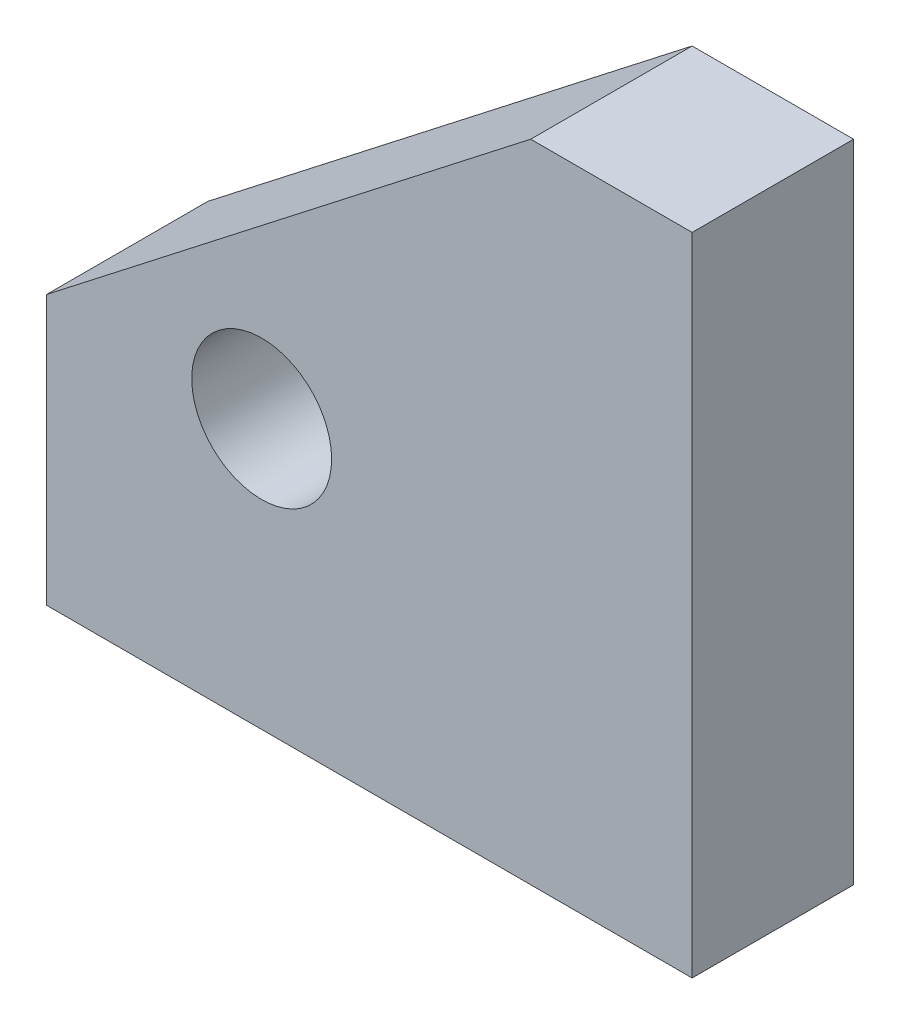
ISO-10303-21;
HEADER;
FILE_DESCRIPTION(('STEP AP214'),'2;1');
FILE_NAME('part.step','',(''),(''),'','','');
FILE_SCHEMA(('AUTOMOTIVE_DESIGN { 1 0 10303 214 1 1 1 1 }'));
ENDSEC;
DATA;
#1=APPLICATION_CONTEXT('core data for automotive mechanical design processes');
#2=APPLICATION_PROTOCOL_DEFINITION('international standard','automotive_design',2000,#1);
#3=PRODUCT_CONTEXT('',#1,'mechanical');
#4=PRODUCT('Part','Part','',(#3));
#5=PRODUCT_RELATED_PRODUCT_CATEGORY('part','',(#4));
#6=PRODUCT_DEFINITION_FORMATION('','',#4);
#7=PRODUCT_DEFINITION_CONTEXT('part definition',#1,'design');
#8=PRODUCT_DEFINITION('design','',#6,#7);
#9=PRODUCT_DEFINITION_SHAPE('','',#8);
#10=(LENGTH_UNIT() NAMED_UNIT(*) SI_UNIT(.MILLI.,.METRE.));
#11=(NAMED_UNIT(*) PLANE_ANGLE_UNIT() SI_UNIT($,.RADIAN.));
#12=(NAMED_UNIT(*) SI_UNIT($,.STERADIAN.) SOLID_ANGLE_UNIT());
#13=UNCERTAINTY_MEASURE_WITH_UNIT(LENGTH_MEASURE(1.E-05),#10,'distance_accuracy_value','');
#14=(GEOMETRIC_REPRESENTATION_CONTEXT(3) GLOBAL_UNCERTAINTY_ASSIGNED_CONTEXT((#13)) GLOBAL_UNIT_ASSIGNED_CONTEXT((#10,
#11,#12)) REPRESENTATION_CONTEXT('',''));
#15=CARTESIAN_POINT('',(0.,0.,0.));
#16=DIRECTION('',(0.,0.,1.));
#17=DIRECTION('',(1.,0.,0.));
#18=AXIS2_PLACEMENT_3D('',#15,#16,#17);
#19=CARTESIAN_POINT('',(-34.7307692307692,44.6538461538462,-15.));
#20=DIRECTION('',(0.61394061351492,-0.789352217376326,0.));
#21=DIRECTION('',(0.789352217376326,0.61394061351492,0.));
#22=AXIS2_PLACEMENT_3D('',#19,#20,#21);
#23=PLANE('',#22);
#24=DIRECTION('',(0.789352217376326,0.61394061351492,0.));
#25=VECTOR('',#24,1.);
#26=CARTESIAN_POINT('',(-34.7307692307692,44.6538461538462,0.));
#27=LINE('',#26,#25);
#28=CARTESIAN_POINT('',(-60.,25.,0.));
#29=VERTEX_POINT('',#28);
#30=CARTESIAN_POINT('',(-15.,60.,0.));
#31=VERTEX_POINT('',#30);
#32=EDGE_CURVE('E132',#29,#31,#27,.T.);
#33=ORIENTED_EDGE('',*,*,#32,.T.);
#34=DIRECTION('',(0.,0.,1.));
#35=VECTOR('',#34,1.);
#36=CARTESIAN_POINT('',(-15.,60.,-15.));
#37=LINE('',#36,#35);
#38=CARTESIAN_POINT('',(-15.,60.,-15.));
#39=VERTEX_POINT('',#38);
#40=EDGE_CURVE('E11',#39,#31,#37,.T.);
#41=ORIENTED_EDGE('',*,*,#40,.F.);
#42=DIRECTION('',(0.789352217376326,0.61394061351492,0.));
#43=VECTOR('',#42,1.);
#44=CARTESIAN_POINT('',(-34.7307692307692,44.6538461538462,-15.));
#45=LINE('',#44,#43);
#46=CARTESIAN_POINT('',(-60.,25.,-15.));
#47=VERTEX_POINT('',#46);
#48=EDGE_CURVE('E122',#47,#39,#45,.T.);
#49=ORIENTED_EDGE('',*,*,#48,.F.);
#50=DIRECTION('',(0.,0.,1.));
#51=VECTOR('',#50,1.);
#52=CARTESIAN_POINT('',(-60.,25.,-15.));
#53=LINE('',#52,#51);
#54=EDGE_CURVE('E50',#47,#29,#53,.T.);
#55=ORIENTED_EDGE('',*,*,#54,.T.);
#56=EDGE_LOOP('',(#33,#41,#49,#55));
#57=FACE_BOUND('',#56,.T.);
#58=ADVANCED_FACE('F46',(#57),#23,.F.);
#59=CARTESIAN_POINT('',(0.,60.,-15.));
#60=DIRECTION('',(0.,-1.,0.));
#61=DIRECTION('',(1.,0.,0.));
#62=AXIS2_PLACEMENT_3D('',#59,#60,#61);
#63=PLANE('',#62);
#64=DIRECTION('',(1.,0.,0.));
#65=VECTOR('',#64,1.);
#66=CARTESIAN_POINT('',(0.,60.,0.));
#67=LINE('',#66,#65);
#68=CARTESIAN_POINT('',(0.,60.,0.));
#69=VERTEX_POINT('',#68);
#70=EDGE_CURVE('E82',#31,#69,#67,.T.);
#71=ORIENTED_EDGE('',*,*,#70,.T.);
#72=DIRECTION('',(0.,0.,1.));
#73=VECTOR('',#72,1.);
#74=CARTESIAN_POINT('',(0.,60.,-15.));
#75=LINE('',#74,#73);
#76=CARTESIAN_POINT('',(0.,60.,-15.));
#77=VERTEX_POINT('',#76);
#78=EDGE_CURVE('E57',#77,#69,#75,.T.);
#79=ORIENTED_EDGE('',*,*,#78,.F.);
#80=DIRECTION('',(1.,0.,0.));
#81=VECTOR('',#80,1.);
#82=CARTESIAN_POINT('',(0.,60.,-15.));
#83=LINE('',#82,#81);
#84=EDGE_CURVE('E65',#39,#77,#83,.T.);
#85=ORIENTED_EDGE('',*,*,#84,.F.);
#86=ORIENTED_EDGE('',*,*,#40,.T.);
#87=EDGE_LOOP('',(#71,#79,#85,#86));
#88=FACE_BOUND('',#87,.T.);
#89=ADVANCED_FACE('F169',(#88),#63,.F.);
#90=CARTESIAN_POINT('',(0.,0.,-15.));
#91=DIRECTION('',(-1.,0.,0.));
#92=DIRECTION('',(0.,-1.,0.));
#93=AXIS2_PLACEMENT_3D('',#90,#91,#92);
#94=PLANE('',#93);
#95=DIRECTION('',(0.,-1.,0.));
#96=VECTOR('',#95,1.);
#97=CARTESIAN_POINT('',(0.,0.,0.));
#98=LINE('',#97,#96);
#99=CARTESIAN_POINT('',(0.,0.,0.));
#100=VERTEX_POINT('',#99);
#101=EDGE_CURVE('E111',#69,#100,#98,.T.);
#102=ORIENTED_EDGE('',*,*,#101,.T.);
#103=DIRECTION('',(0.,0.,1.));
#104=VECTOR('',#103,1.);
#105=CARTESIAN_POINT('',(0.,0.,-15.));
#106=LINE('',#105,#104);
#107=CARTESIAN_POINT('',(0.,0.,-15.));
#108=VERTEX_POINT('',#107);
#109=EDGE_CURVE('E109',#108,#100,#106,.T.);
#110=ORIENTED_EDGE('',*,*,#109,.F.);
#111=DIRECTION('',(0.,-1.,0.));
#112=VECTOR('',#111,1.);
#113=CARTESIAN_POINT('',(0.,0.,-15.));
#114=LINE('',#113,#112);
#115=EDGE_CURVE('E99',#77,#108,#114,.T.);
#116=ORIENTED_EDGE('',*,*,#115,.F.);
#117=ORIENTED_EDGE('',*,*,#78,.T.);
#118=EDGE_LOOP('',(#102,#110,#116,#117));
#119=FACE_BOUND('',#118,.T.);
#120=ADVANCED_FACE('F110',(#119),#94,.F.);
#121=CARTESIAN_POINT('',(0.,0.,-15.));
#122=DIRECTION('',(0.,1.,0.));
#123=DIRECTION('',(0.,0.,1.));
#124=AXIS2_PLACEMENT_3D('',#121,#122,#123);
#125=PLANE('',#124);
#126=DIRECTION('',(-1.,0.,0.));
#127=VECTOR('',#126,1.);
#128=CARTESIAN_POINT('',(0.,0.,0.));
#129=LINE('',#128,#127);
#130=CARTESIAN_POINT('',(-60.,0.,0.));
#131=VERTEX_POINT('',#130);
#132=EDGE_CURVE('E139',#100,#131,#129,.T.);
#133=ORIENTED_EDGE('',*,*,#132,.T.);
#134=DIRECTION('',(0.,0.,1.));
#135=VECTOR('',#134,1.);
#136=CARTESIAN_POINT('',(-60.,0.,-15.));
#137=LINE('',#136,#135);
#138=CARTESIAN_POINT('',(-60.,0.,-15.));
#139=VERTEX_POINT('',#138);
#140=EDGE_CURVE('E115',#139,#131,#137,.T.);
#141=ORIENTED_EDGE('',*,*,#140,.F.);
#142=DIRECTION('',(-1.,0.,0.));
#143=VECTOR('',#142,1.);
#144=CARTESIAN_POINT('',(0.,0.,-15.));
#145=LINE('',#144,#143);
#146=EDGE_CURVE('E103',#108,#139,#145,.T.);
#147=ORIENTED_EDGE('',*,*,#146,.F.);
#148=ORIENTED_EDGE('',*,*,#109,.T.);
#149=EDGE_LOOP('',(#133,#141,#147,#148));
#150=FACE_BOUND('',#149,.T.);
#151=ADVANCED_FACE('F117',(#150),#125,.F.);
#152=CARTESIAN_POINT('',(-40.,25.,-15.));
#153=DIRECTION('',(0.,0.,1.));
#154=DIRECTION('',(1.,0.,0.));
#155=AXIS2_PLACEMENT_3D('',#152,#153,#154);
#156=CYLINDRICAL_SURFACE('',#155,6.5);
#157=CARTESIAN_POINT('',(-40.,25.,-15.));
#158=DIRECTION('',(0.,0.,1.));
#159=DIRECTION('',(1.,0.,0.));
#160=AXIS2_PLACEMENT_3D('',#157,#158,#159);
#161=CIRCLE('',#160,6.5);
#162=CARTESIAN_POINT('',(-33.5,25.,-15.));
#163=VERTEX_POINT('',#162);
#164=EDGE_CURVE('E145',#163,#163,#161,.T.);
#165=ORIENTED_EDGE('',*,*,#164,.F.);
#166=EDGE_LOOP('',(#165));
#167=FACE_BOUND('',#166,.T.);
#168=CARTESIAN_POINT('',(-40.,25.,0.));
#169=DIRECTION('',(0.,0.,1.));
#170=DIRECTION('',(1.,0.,0.));
#171=AXIS2_PLACEMENT_3D('',#168,#169,#170);
#172=CIRCLE('',#171,6.5);
#173=CARTESIAN_POINT('',(-33.5,25.,0.));
#174=VERTEX_POINT('',#173);
#175=EDGE_CURVE('E128',#174,#174,#172,.T.);
#176=ORIENTED_EDGE('',*,*,#175,.T.);
#177=EDGE_LOOP('',(#176));
#178=FACE_BOUND('',#177,.T.);
#179=ADVANCED_FACE('F48',(#167,#178),#156,.F.);
#180=CARTESIAN_POINT('',(-60.,0.,-15.));
#181=DIRECTION('',(1.,0.,0.));
#182=DIRECTION('',(0.,0.,-1.));
#183=AXIS2_PLACEMENT_3D('',#180,#181,#182);
#184=PLANE('',#183);
#185=DIRECTION('',(0.,1.,0.));
#186=VECTOR('',#185,1.);
#187=CARTESIAN_POINT('',(-60.,0.,0.));
#188=LINE('',#187,#186);
#189=EDGE_CURVE('E136',#131,#29,#188,.T.);
#190=ORIENTED_EDGE('',*,*,#189,.T.);
#191=ORIENTED_EDGE('',*,*,#54,.F.);
#192=DIRECTION('',(0.,1.,0.));
#193=VECTOR('',#192,1.);
#194=CARTESIAN_POINT('',(-60.,0.,-15.));
#195=LINE('',#194,#193);
#196=EDGE_CURVE('E94',#139,#47,#195,.T.);
#197=ORIENTED_EDGE('',*,*,#196,.F.);
#198=ORIENTED_EDGE('',*,*,#140,.T.);
#199=EDGE_LOOP('',(#190,#191,#197,#198));
#200=FACE_BOUND('',#199,.T.);
#201=ADVANCED_FACE('F157',(#200),#184,.F.);
#202=CARTESIAN_POINT('',(0.,0.,-15.));
#203=DIRECTION('',(0.,0.,1.));
#204=DIRECTION('',(1.,0.,0.));
#205=AXIS2_PLACEMENT_3D('',#202,#203,#204);
#206=PLANE('',#205);
#207=ORIENTED_EDGE('',*,*,#164,.T.);
#208=EDGE_LOOP('',(#207));
#209=FACE_BOUND('',#208,.T.);
#210=ORIENTED_EDGE('',*,*,#48,.T.);
#211=ORIENTED_EDGE('',*,*,#84,.T.);
#212=ORIENTED_EDGE('',*,*,#115,.T.);
#213=ORIENTED_EDGE('',*,*,#146,.T.);
#214=ORIENTED_EDGE('',*,*,#196,.T.);
#215=EDGE_LOOP('',(#210,#211,#212,#213,#214));
#216=FACE_BOUND('',#215,.T.);
#217=ADVANCED_FACE('F101',(#209,#216),#206,.F.);
#218=CARTESIAN_POINT('',(0.,0.,0.));
#219=DIRECTION('',(0.,0.,1.));
#220=DIRECTION('',(1.,0.,0.));
#221=AXIS2_PLACEMENT_3D('',#218,#219,#220);
#222=PLANE('',#221);
#223=ORIENTED_EDGE('',*,*,#175,.F.);
#224=EDGE_LOOP('',(#223));
#225=FACE_BOUND('',#224,.T.);
#226=ORIENTED_EDGE('',*,*,#32,.F.);
#227=ORIENTED_EDGE('',*,*,#189,.F.);
#228=ORIENTED_EDGE('',*,*,#132,.F.);
#229=ORIENTED_EDGE('',*,*,#101,.F.);
#230=ORIENTED_EDGE('',*,*,#70,.F.);
#231=EDGE_LOOP('',(#226,#227,#228,#229,#230));
#232=FACE_BOUND('',#231,.T.);
#233=ADVANCED_FACE('F156',(#225,#232),#222,.T.);
#234=CLOSED_SHELL('',(#58,#89,#120,#151,#179,#201,#217,#233));
#235=MANIFOLD_SOLID_BREP('B2',#234);
#236=ADVANCED_BREP_SHAPE_REPRESENTATION('',(#18,#235),#14);
#237=SHAPE_DEFINITION_REPRESENTATION(#9,#236);
ENDSEC;
END-ISO-10303-21;
